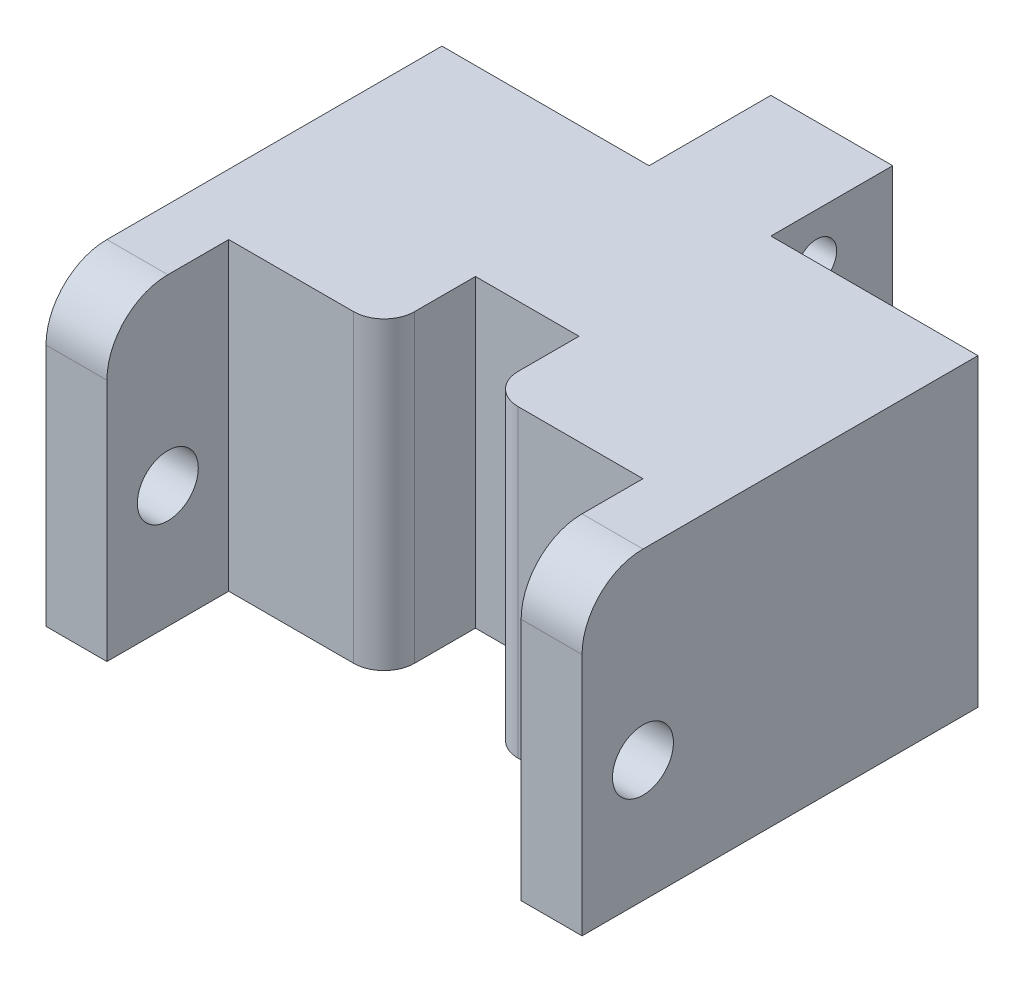
ISO-10303-21;
HEADER;
FILE_DESCRIPTION(('STEP AP214'),'2;1');
FILE_NAME('part.step','',(''),(''),'','','');
FILE_SCHEMA(('AUTOMOTIVE_DESIGN { 1 0 10303 214 1 1 1 1 }'));
ENDSEC;
DATA;
#1=APPLICATION_CONTEXT('core data for automotive mechanical design processes');
#2=APPLICATION_PROTOCOL_DEFINITION('international standard','automotive_design',2000,#1);
#3=PRODUCT_CONTEXT('',#1,'mechanical');
#4=PRODUCT('Part','Part','',(#3));
#5=PRODUCT_RELATED_PRODUCT_CATEGORY('part','',(#4));
#6=PRODUCT_DEFINITION_FORMATION('','',#4);
#7=PRODUCT_DEFINITION_CONTEXT('part definition',#1,'design');
#8=PRODUCT_DEFINITION('design','',#6,#7);
#9=PRODUCT_DEFINITION_SHAPE('','',#8);
#10=(LENGTH_UNIT() NAMED_UNIT(*) SI_UNIT(.MILLI.,.METRE.));
#11=(NAMED_UNIT(*) PLANE_ANGLE_UNIT() SI_UNIT($,.RADIAN.));
#12=(NAMED_UNIT(*) SI_UNIT($,.STERADIAN.) SOLID_ANGLE_UNIT());
#13=UNCERTAINTY_MEASURE_WITH_UNIT(LENGTH_MEASURE(1.E-05),#10,'distance_accuracy_value','');
#14=(GEOMETRIC_REPRESENTATION_CONTEXT(3) GLOBAL_UNCERTAINTY_ASSIGNED_CONTEXT((#13)) GLOBAL_UNIT_ASSIGNED_CONTEXT((#10,
#11,#12)) REPRESENTATION_CONTEXT('',''));
#15=CARTESIAN_POINT('',(0.,0.,0.));
#16=DIRECTION('',(0.,0.,1.));
#17=DIRECTION('',(1.,0.,0.));
#18=AXIS2_PLACEMENT_3D('',#15,#16,#17);
#19=CARTESIAN_POINT('',(-24.,50.,65.));
#20=DIRECTION('',(1.,0.,0.));
#21=DIRECTION('',(0.,0.,-1.));
#22=AXIS2_PLACEMENT_3D('',#19,#20,#21);
#23=PLANE('',#22);
#24=CARTESIAN_POINT('',(-24.,20.,75.));
#25=DIRECTION('',(1.,0.,0.));
#26=DIRECTION('',(0.,0.,-1.));
#27=AXIS2_PLACEMENT_3D('',#24,#25,#26);
#28=CIRCLE('',#27,5.);
#29=CARTESIAN_POINT('',(-24.,20.,70.));
#30=VERTEX_POINT('',#29);
#31=EDGE_CURVE('E189',#30,#30,#28,.T.);
#32=ORIENTED_EDGE('',*,*,#31,.F.);
#33=EDGE_LOOP('',(#32));
#34=FACE_BOUND('',#33,.T.);
#35=DIRECTION('',(0.,0.,1.));
#36=VECTOR('',#35,1.);
#37=CARTESIAN_POINT('',(-24.,50.,65.));
#38=LINE('',#37,#36);
#39=CARTESIAN_POINT('',(-24.,50.,65.));
#40=VERTEX_POINT('',#39);
#41=CARTESIAN_POINT('',(-24.,50.,75.));
#42=VERTEX_POINT('',#41);
#43=EDGE_CURVE('E271',#40,#42,#38,.T.);
#44=ORIENTED_EDGE('',*,*,#43,.T.);
#45=CARTESIAN_POINT('',(-24.,40.,75.));
#46=DIRECTION('',(1.,0.,0.));
#47=DIRECTION('',(0.,0.,-1.));
#48=AXIS2_PLACEMENT_3D('',#45,#46,#47);
#49=CIRCLE('',#48,10.);
#50=CARTESIAN_POINT('',(-24.,40.,85.));
#51=VERTEX_POINT('',#50);
#52=EDGE_CURVE('E217',#42,#51,#49,.T.);
#53=ORIENTED_EDGE('',*,*,#52,.T.);
#54=DIRECTION('',(0.,-1.,0.));
#55=VECTOR('',#54,1.);
#56=CARTESIAN_POINT('',(-24.,50.,85.));
#57=LINE('',#56,#55);
#58=CARTESIAN_POINT('',(-24.,0.,85.));
#59=VERTEX_POINT('',#58);
#60=EDGE_CURVE('E206',#51,#59,#57,.T.);
#61=ORIENTED_EDGE('',*,*,#60,.T.);
#62=DIRECTION('',(0.,0.,1.));
#63=VECTOR('',#62,1.);
#64=CARTESIAN_POINT('',(-24.,0.,65.));
#65=LINE('',#64,#63);
#66=CARTESIAN_POINT('',(-24.,0.,65.));
#67=VERTEX_POINT('',#66);
#68=EDGE_CURVE('E299',#67,#59,#65,.T.);
#69=ORIENTED_EDGE('',*,*,#68,.F.);
#70=DIRECTION('',(0.,-1.,0.));
#71=VECTOR('',#70,1.);
#72=CARTESIAN_POINT('',(-24.,50.,65.));
#73=LINE('',#72,#71);
#74=EDGE_CURVE('E213',#40,#67,#73,.T.);
#75=ORIENTED_EDGE('',*,*,#74,.F.);
#76=EDGE_LOOP('',(#44,#53,#61,#69,#75));
#77=FACE_BOUND('',#76,.T.);
#78=ADVANCED_FACE('F33',(#34,#77),#23,.T.);
#79=CARTESIAN_POINT('',(-24.,50.,65.));
#80=DIRECTION('',(0.,0.,-1.));
#81=DIRECTION('',(-1.,0.,0.));
#82=AXIS2_PLACEMENT_3D('',#79,#80,#81);
#83=PLANE('',#82);
#84=DIRECTION('',(1.,0.,0.));
#85=VECTOR('',#84,1.);
#86=CARTESIAN_POINT('',(-24.,0.,65.));
#87=LINE('',#86,#85);
#88=CARTESIAN_POINT('',(-3.50000000000001,0.,65.));
#89=VERTEX_POINT('',#88);
#90=EDGE_CURVE('E268',#67,#89,#87,.T.);
#91=ORIENTED_EDGE('',*,*,#90,.T.);
#92=DIRECTION('',(0.,-1.,0.));
#93=VECTOR('',#92,1.);
#94=CARTESIAN_POINT('',(-3.50000000000001,50.,65.));
#95=LINE('',#94,#93);
#96=CARTESIAN_POINT('',(-3.50000000000001,50.,65.));
#97=VERTEX_POINT('',#96);
#98=EDGE_CURVE('E233',#89,#97,#95,.F.);
#99=ORIENTED_EDGE('',*,*,#98,.T.);
#100=DIRECTION('',(1.,0.,0.));
#101=VECTOR('',#100,1.);
#102=CARTESIAN_POINT('',(-24.,50.,65.));
#103=LINE('',#102,#101);
#104=EDGE_CURVE('E208',#40,#97,#103,.T.);
#105=ORIENTED_EDGE('',*,*,#104,.F.);
#106=ORIENTED_EDGE('',*,*,#74,.T.);
#107=EDGE_LOOP('',(#91,#99,#105,#106));
#108=FACE_BOUND('',#107,.T.);
#109=ADVANCED_FACE('F364',(#108),#83,.F.);
#110=CARTESIAN_POINT('',(1.49999999999999,50.,65.));
#111=DIRECTION('',(-1.,0.,0.));
#112=DIRECTION('',(0.,0.,1.));
#113=AXIS2_PLACEMENT_3D('',#110,#111,#112);
#114=PLANE('',#113);
#115=DIRECTION('',(0.,0.,-1.));
#116=VECTOR('',#115,1.);
#117=CARTESIAN_POINT('',(1.49999999999999,50.,65.));
#118=LINE('',#117,#116);
#119=CARTESIAN_POINT('',(1.49999999999999,50.,60.));
#120=VERTEX_POINT('',#119);
#121=CARTESIAN_POINT('',(1.49999999999999,50.,50.));
#122=VERTEX_POINT('',#121);
#123=EDGE_CURVE('E328',#120,#122,#118,.T.);
#124=ORIENTED_EDGE('',*,*,#123,.F.);
#125=DIRECTION('',(0.,-1.,0.));
#126=VECTOR('',#125,1.);
#127=CARTESIAN_POINT('',(1.49999999999999,50.,60.));
#128=LINE('',#127,#126);
#129=CARTESIAN_POINT('',(1.49999999999999,0.,60.));
#130=VERTEX_POINT('',#129);
#131=EDGE_CURVE('E228',#120,#130,#128,.T.);
#132=ORIENTED_EDGE('',*,*,#131,.T.);
#133=DIRECTION('',(0.,0.,-1.));
#134=VECTOR('',#133,1.);
#135=CARTESIAN_POINT('',(1.49999999999999,0.,65.));
#136=LINE('',#135,#134);
#137=CARTESIAN_POINT('',(1.49999999999999,0.,50.));
#138=VERTEX_POINT('',#137);
#139=EDGE_CURVE('E266',#130,#138,#136,.T.);
#140=ORIENTED_EDGE('',*,*,#139,.T.);
#141=DIRECTION('',(0.,-1.,0.));
#142=VECTOR('',#141,1.);
#143=CARTESIAN_POINT('',(1.49999999999999,50.,50.));
#144=LINE('',#143,#142);
#145=EDGE_CURVE('E273',#122,#138,#144,.T.);
#146=ORIENTED_EDGE('',*,*,#145,.F.);
#147=EDGE_LOOP('',(#124,#132,#140,#146));
#148=FACE_BOUND('',#147,.T.);
#149=ADVANCED_FACE('F372',(#148),#114,.F.);
#150=CARTESIAN_POINT('',(1.49999999999999,50.,50.));
#151=DIRECTION('',(0.,0.,-1.));
#152=DIRECTION('',(-1.,0.,0.));
#153=AXIS2_PLACEMENT_3D('',#150,#151,#152);
#154=PLANE('',#153);
#155=DIRECTION('',(1.,0.,0.));
#156=VECTOR('',#155,1.);
#157=CARTESIAN_POINT('',(1.49999999999999,0.,50.));
#158=LINE('',#157,#156);
#159=CARTESIAN_POINT('',(18.5,0.,50.));
#160=VERTEX_POINT('',#159);
#161=EDGE_CURVE('E259',#138,#160,#158,.T.);
#162=ORIENTED_EDGE('',*,*,#161,.T.);
#163=DIRECTION('',(0.,-1.,0.));
#164=VECTOR('',#163,1.);
#165=CARTESIAN_POINT('',(18.5,50.,50.));
#166=LINE('',#165,#164);
#167=CARTESIAN_POINT('',(18.5,50.,50.));
#168=VERTEX_POINT('',#167);
#169=EDGE_CURVE('E276',#168,#160,#166,.T.);
#170=ORIENTED_EDGE('',*,*,#169,.F.);
#171=DIRECTION('',(1.,0.,0.));
#172=VECTOR('',#171,1.);
#173=CARTESIAN_POINT('',(1.49999999999999,50.,50.));
#174=LINE('',#173,#172);
#175=EDGE_CURVE('E326',#122,#168,#174,.T.);
#176=ORIENTED_EDGE('',*,*,#175,.F.);
#177=ORIENTED_EDGE('',*,*,#145,.T.);
#178=EDGE_LOOP('',(#162,#170,#176,#177));
#179=FACE_BOUND('',#178,.T.);
#180=ADVANCED_FACE('F419',(#179),#154,.F.);
#181=CARTESIAN_POINT('',(18.5,50.,50.));
#182=DIRECTION('',(1.,0.,0.));
#183=DIRECTION('',(0.,0.,-1.));
#184=AXIS2_PLACEMENT_3D('',#181,#182,#183);
#185=PLANE('',#184);
#186=DIRECTION('',(0.,0.,1.));
#187=VECTOR('',#186,1.);
#188=CARTESIAN_POINT('',(18.5,0.,50.));
#189=LINE('',#188,#187);
#190=CARTESIAN_POINT('',(18.5,0.,60.));
#191=VERTEX_POINT('',#190);
#192=EDGE_CURVE('E257',#160,#191,#189,.T.);
#193=ORIENTED_EDGE('',*,*,#192,.T.);
#194=DIRECTION('',(0.,-1.,0.));
#195=VECTOR('',#194,1.);
#196=CARTESIAN_POINT('',(18.5,50.,60.));
#197=LINE('',#196,#195);
#198=CARTESIAN_POINT('',(18.5,50.,60.));
#199=VERTEX_POINT('',#198);
#200=EDGE_CURVE('E41',#191,#199,#197,.F.);
#201=ORIENTED_EDGE('',*,*,#200,.T.);
#202=DIRECTION('',(0.,0.,1.));
#203=VECTOR('',#202,1.);
#204=CARTESIAN_POINT('',(18.5,50.,50.));
#205=LINE('',#204,#203);
#206=EDGE_CURVE('E324',#168,#199,#205,.T.);
#207=ORIENTED_EDGE('',*,*,#206,.F.);
#208=ORIENTED_EDGE('',*,*,#169,.T.);
#209=EDGE_LOOP('',(#193,#201,#207,#208));
#210=FACE_BOUND('',#209,.T.);
#211=ADVANCED_FACE('F421',(#210),#185,.F.);
#212=CARTESIAN_POINT('',(44.,50.,65.));
#213=DIRECTION('',(0.,0.,1.));
#214=DIRECTION('',(1.,0.,0.));
#215=AXIS2_PLACEMENT_3D('',#212,#213,#214);
#216=PLANE('',#215);
#217=DIRECTION('',(-1.,0.,0.));
#218=VECTOR('',#217,1.);
#219=CARTESIAN_POINT('',(44.,50.,65.));
#220=LINE('',#219,#218);
#221=CARTESIAN_POINT('',(44.,50.,65.));
#222=VERTEX_POINT('',#221);
#223=CARTESIAN_POINT('',(23.5,50.,65.));
#224=VERTEX_POINT('',#223);
#225=EDGE_CURVE('E249',#222,#224,#220,.T.);
#226=ORIENTED_EDGE('',*,*,#225,.T.);
#227=DIRECTION('',(0.,-1.,0.));
#228=VECTOR('',#227,1.);
#229=CARTESIAN_POINT('',(23.5,0.,65.));
#230=LINE('',#229,#228);
#231=CARTESIAN_POINT('',(23.5,0.,65.));
#232=VERTEX_POINT('',#231);
#233=EDGE_CURVE('E237',#224,#232,#230,.T.);
#234=ORIENTED_EDGE('',*,*,#233,.T.);
#235=DIRECTION('',(-1.,0.,0.));
#236=VECTOR('',#235,1.);
#237=CARTESIAN_POINT('',(44.,0.,65.));
#238=LINE('',#237,#236);
#239=CARTESIAN_POINT('',(44.,0.,65.));
#240=VERTEX_POINT('',#239);
#241=EDGE_CURVE('E246',#240,#232,#238,.T.);
#242=ORIENTED_EDGE('',*,*,#241,.F.);
#243=DIRECTION('',(0.,-1.,0.));
#244=VECTOR('',#243,1.);
#245=CARTESIAN_POINT('',(44.,50.,65.));
#246=LINE('',#245,#244);
#247=EDGE_CURVE('E279',#222,#240,#246,.T.);
#248=ORIENTED_EDGE('',*,*,#247,.F.);
#249=EDGE_LOOP('',(#226,#234,#242,#248));
#250=FACE_BOUND('',#249,.T.);
#251=ADVANCED_FACE('F244',(#250),#216,.T.);
#252=CARTESIAN_POINT('',(44.,50.,85.));
#253=DIRECTION('',(-1.,0.,0.));
#254=DIRECTION('',(0.,0.,1.));
#255=AXIS2_PLACEMENT_3D('',#252,#253,#254);
#256=PLANE('',#255);
#257=CARTESIAN_POINT('',(44.,20.,75.));
#258=DIRECTION('',(-1.,0.,0.));
#259=DIRECTION('',(0.,0.,1.));
#260=AXIS2_PLACEMENT_3D('',#257,#258,#259);
#261=CIRCLE('',#260,5.);
#262=CARTESIAN_POINT('',(44.,20.,80.));
#263=VERTEX_POINT('',#262);
#264=EDGE_CURVE('E463',#263,#263,#261,.T.);
#265=ORIENTED_EDGE('',*,*,#264,.F.);
#266=EDGE_LOOP('',(#265));
#267=FACE_BOUND('',#266,.T.);
#268=DIRECTION('',(0.,-1.,0.));
#269=VECTOR('',#268,1.);
#270=CARTESIAN_POINT('',(44.,50.,85.));
#271=LINE('',#270,#269);
#272=CARTESIAN_POINT('',(44.,40.,85.));
#273=VERTEX_POINT('',#272);
#274=CARTESIAN_POINT('',(44.,0.,85.));
#275=VERTEX_POINT('',#274);
#276=EDGE_CURVE('E281',#273,#275,#271,.T.);
#277=ORIENTED_EDGE('',*,*,#276,.F.);
#278=CARTESIAN_POINT('',(44.,40.,75.));
#279=DIRECTION('',(-1.,0.,0.));
#280=DIRECTION('',(0.,0.,1.));
#281=AXIS2_PLACEMENT_3D('',#278,#279,#280);
#282=CIRCLE('',#281,10.);
#283=CARTESIAN_POINT('',(44.,50.,75.));
#284=VERTEX_POINT('',#283);
#285=EDGE_CURVE('E222',#273,#284,#282,.T.);
#286=ORIENTED_EDGE('',*,*,#285,.T.);
#287=DIRECTION('',(0.,0.,-1.));
#288=VECTOR('',#287,1.);
#289=CARTESIAN_POINT('',(44.,50.,85.));
#290=LINE('',#289,#288);
#291=EDGE_CURVE('E321',#284,#222,#290,.T.);
#292=ORIENTED_EDGE('',*,*,#291,.T.);
#293=ORIENTED_EDGE('',*,*,#247,.T.);
#294=DIRECTION('',(0.,0.,-1.));
#295=VECTOR('',#294,1.);
#296=CARTESIAN_POINT('',(44.,0.,85.));
#297=LINE('',#296,#295);
#298=EDGE_CURVE('E256',#275,#240,#297,.T.);
#299=ORIENTED_EDGE('',*,*,#298,.F.);
#300=EDGE_LOOP('',(#277,#286,#292,#293,#299));
#301=FACE_BOUND('',#300,.T.);
#302=ADVANCED_FACE('F348',(#267,#301),#256,.T.);
#303=CARTESIAN_POINT('',(54.,50.,85.));
#304=DIRECTION('',(0.,0.,1.));
#305=DIRECTION('',(1.,0.,0.));
#306=AXIS2_PLACEMENT_3D('',#303,#304,#305);
#307=PLANE('',#306);
#308=DIRECTION('',(0.,-1.,0.));
#309=VECTOR('',#308,1.);
#310=CARTESIAN_POINT('',(54.,50.,85.));
#311=LINE('',#310,#309);
#312=CARTESIAN_POINT('',(54.,40.,85.));
#313=VERTEX_POINT('',#312);
#314=CARTESIAN_POINT('',(54.,0.,85.));
#315=VERTEX_POINT('',#314);
#316=EDGE_CURVE('E283',#313,#315,#311,.T.);
#317=ORIENTED_EDGE('',*,*,#316,.F.);
#318=DIRECTION('',(-1.,0.,0.));
#319=VECTOR('',#318,1.);
#320=CARTESIAN_POINT('',(44.,40.,85.));
#321=LINE('',#320,#319);
#322=EDGE_CURVE('E219',#313,#273,#321,.T.);
#323=ORIENTED_EDGE('',*,*,#322,.T.);
#324=ORIENTED_EDGE('',*,*,#276,.T.);
#325=DIRECTION('',(-1.,0.,0.));
#326=VECTOR('',#325,1.);
#327=CARTESIAN_POINT('',(54.,0.,85.));
#328=LINE('',#327,#326);
#329=EDGE_CURVE('E261',#315,#275,#328,.T.);
#330=ORIENTED_EDGE('',*,*,#329,.F.);
#331=EDGE_LOOP('',(#317,#323,#324,#330));
#332=FACE_BOUND('',#331,.T.);
#333=ADVANCED_FACE('F344',(#332),#307,.T.);
#334=CARTESIAN_POINT('',(54.,50.,20.));
#335=DIRECTION('',(1.,0.,0.));
#336=DIRECTION('',(0.,0.,-1.));
#337=AXIS2_PLACEMENT_3D('',#334,#335,#336);
#338=PLANE('',#337);
#339=CARTESIAN_POINT('',(54.,20.,75.));
#340=DIRECTION('',(1.,0.,0.));
#341=DIRECTION('',(0.,0.,-1.));
#342=AXIS2_PLACEMENT_3D('',#339,#340,#341);
#343=CIRCLE('',#342,5.);
#344=CARTESIAN_POINT('',(54.,20.,70.));
#345=VERTEX_POINT('',#344);
#346=EDGE_CURVE('E459',#345,#345,#343,.T.);
#347=ORIENTED_EDGE('',*,*,#346,.F.);
#348=EDGE_LOOP('',(#347));
#349=FACE_BOUND('',#348,.T.);
#350=DIRECTION('',(0.,0.,1.));
#351=VECTOR('',#350,1.);
#352=CARTESIAN_POINT('',(54.,50.,20.));
#353=LINE('',#352,#351);
#354=CARTESIAN_POINT('',(54.,50.,20.));
#355=VERTEX_POINT('',#354);
#356=CARTESIAN_POINT('',(54.,50.,75.));
#357=VERTEX_POINT('',#356);
#358=EDGE_CURVE('E318',#355,#357,#353,.T.);
#359=ORIENTED_EDGE('',*,*,#358,.T.);
#360=CARTESIAN_POINT('',(54.,40.,75.));
#361=DIRECTION('',(1.,0.,0.));
#362=DIRECTION('',(0.,0.,-1.));
#363=AXIS2_PLACEMENT_3D('',#360,#361,#362);
#364=CIRCLE('',#363,10.);
#365=EDGE_CURVE('E226',#357,#313,#364,.T.);
#366=ORIENTED_EDGE('',*,*,#365,.T.);
#367=ORIENTED_EDGE('',*,*,#316,.T.);
#368=DIRECTION('',(0.,0.,1.));
#369=VECTOR('',#368,1.);
#370=CARTESIAN_POINT('',(54.,0.,20.));
#371=LINE('',#370,#369);
#372=CARTESIAN_POINT('',(54.,0.,20.));
#373=VERTEX_POINT('',#372);
#374=EDGE_CURVE('E338',#373,#315,#371,.T.);
#375=ORIENTED_EDGE('',*,*,#374,.F.);
#376=DIRECTION('',(0.,-1.,0.));
#377=VECTOR('',#376,1.);
#378=CARTESIAN_POINT('',(54.,50.,20.));
#379=LINE('',#378,#377);
#380=EDGE_CURVE('E285',#355,#373,#379,.T.);
#381=ORIENTED_EDGE('',*,*,#380,.F.);
#382=EDGE_LOOP('',(#359,#366,#367,#375,#381));
#383=FACE_BOUND('',#382,.T.);
#384=ADVANCED_FACE('F391',(#349,#383),#338,.T.);
#385=CARTESIAN_POINT('',(20.,50.,20.));
#386=DIRECTION('',(0.,0.,-1.));
#387=DIRECTION('',(-1.,0.,0.));
#388=AXIS2_PLACEMENT_3D('',#385,#386,#387);
#389=PLANE('',#388);
#390=DIRECTION('',(-1.,0.,0.));
#391=VECTOR('',#390,1.);
#392=CARTESIAN_POINT('',(37.,15.,20.));
#393=LINE('',#392,#391);
#394=CARTESIAN_POINT('',(20.,15.,20.));
#395=VERTEX_POINT('',#394);
#396=CARTESIAN_POINT('',(0.,15.,20.));
#397=VERTEX_POINT('',#396);
#398=EDGE_CURVE('E169',#395,#397,#393,.T.);
#399=ORIENTED_EDGE('',*,*,#398,.F.);
#400=DIRECTION('',(0.,-1.,0.));
#401=VECTOR('',#400,1.);
#402=CARTESIAN_POINT('',(20.,50.,20.));
#403=LINE('',#402,#401);
#404=CARTESIAN_POINT('',(20.,50.,20.));
#405=VERTEX_POINT('',#404);
#406=EDGE_CURVE('E288',#405,#395,#403,.T.);
#407=ORIENTED_EDGE('',*,*,#406,.F.);
#408=DIRECTION('',(1.,0.,0.));
#409=VECTOR('',#408,1.);
#410=CARTESIAN_POINT('',(20.,50.,20.));
#411=LINE('',#410,#409);
#412=EDGE_CURVE('E315',#405,#355,#411,.T.);
#413=ORIENTED_EDGE('',*,*,#412,.T.);
#414=ORIENTED_EDGE('',*,*,#380,.T.);
#415=DIRECTION('',(1.,0.,0.));
#416=VECTOR('',#415,1.);
#417=CARTESIAN_POINT('',(20.,0.,20.));
#418=LINE('',#417,#416);
#419=CARTESIAN_POINT('',(-34.,0.,20.));
#420=VERTEX_POINT('',#419);
#421=EDGE_CURVE('E336',#420,#373,#418,.T.);
#422=ORIENTED_EDGE('',*,*,#421,.F.);
#423=DIRECTION('',(0.,-1.,0.));
#424=VECTOR('',#423,1.);
#425=CARTESIAN_POINT('',(-34.,50.,20.));
#426=LINE('',#425,#424);
#427=CARTESIAN_POINT('',(-34.,50.,20.));
#428=VERTEX_POINT('',#427);
#429=EDGE_CURVE('E196',#428,#420,#426,.T.);
#430=ORIENTED_EDGE('',*,*,#429,.F.);
#431=DIRECTION('',(1.,0.,0.));
#432=VECTOR('',#431,1.);
#433=CARTESIAN_POINT('',(-34.,50.,20.));
#434=LINE('',#433,#432);
#435=CARTESIAN_POINT('',(0.,50.,20.));
#436=VERTEX_POINT('',#435);
#437=EDGE_CURVE('E195',#428,#436,#434,.T.);
#438=ORIENTED_EDGE('',*,*,#437,.T.);
#439=DIRECTION('',(0.,-1.,0.));
#440=VECTOR('',#439,1.);
#441=CARTESIAN_POINT('',(0.,50.,20.));
#442=LINE('',#441,#440);
#443=EDGE_CURVE('E185',#436,#397,#442,.T.);
#444=ORIENTED_EDGE('',*,*,#443,.T.);
#445=EDGE_LOOP('',(#399,#407,#413,#414,#422,#430,#438,#444));
#446=FACE_BOUND('',#445,.T.);
#447=ADVANCED_FACE('F192',(#446),#389,.T.);
#448=CARTESIAN_POINT('',(20.,50.,0.));
#449=DIRECTION('',(1.,0.,0.));
#450=DIRECTION('',(0.,0.,-1.));
#451=AXIS2_PLACEMENT_3D('',#448,#449,#450);
#452=PLANE('',#451);
#453=CARTESIAN_POINT('',(20.,27.5,12.5));
#454=DIRECTION('',(1.,0.,0.));
#455=DIRECTION('',(0.,0.,-1.));
#456=AXIS2_PLACEMENT_3D('',#453,#454,#455);
#457=CIRCLE('',#456,3.3);
#458=CARTESIAN_POINT('',(20.,27.5,9.20000000000001));
#459=VERTEX_POINT('',#458);
#460=EDGE_CURVE('E554',#459,#459,#457,.F.);
#461=ORIENTED_EDGE('',*,*,#460,.T.);
#462=EDGE_LOOP('',(#461));
#463=FACE_BOUND('',#462,.T.);
#464=CARTESIAN_POINT('',(20.,42.5,12.5));
#465=DIRECTION('',(1.,0.,0.));
#466=DIRECTION('',(0.,0.,-1.));
#467=AXIS2_PLACEMENT_3D('',#464,#465,#466);
#468=CIRCLE('',#467,3.3);
#469=CARTESIAN_POINT('',(20.,42.5,9.20000000000001));
#470=VERTEX_POINT('',#469);
#471=EDGE_CURVE('E466',#470,#470,#468,.F.);
#472=ORIENTED_EDGE('',*,*,#471,.T.);
#473=EDGE_LOOP('',(#472));
#474=FACE_BOUND('',#473,.T.);
#475=DIRECTION('',(0.,0.,1.));
#476=VECTOR('',#475,1.);
#477=CARTESIAN_POINT('',(20.,15.,0.));
#478=LINE('',#477,#476);
#479=CARTESIAN_POINT('',(20.,15.,0.));
#480=VERTEX_POINT('',#479);
#481=EDGE_CURVE('E175',#480,#395,#478,.T.);
#482=ORIENTED_EDGE('',*,*,#481,.F.);
#483=DIRECTION('',(0.,-1.,0.));
#484=VECTOR('',#483,1.);
#485=CARTESIAN_POINT('',(20.,50.,0.));
#486=LINE('',#485,#484);
#487=CARTESIAN_POINT('',(20.,50.,0.));
#488=VERTEX_POINT('',#487);
#489=EDGE_CURVE('E198',#488,#480,#486,.T.);
#490=ORIENTED_EDGE('',*,*,#489,.F.);
#491=DIRECTION('',(0.,0.,1.));
#492=VECTOR('',#491,1.);
#493=CARTESIAN_POINT('',(20.,50.,0.));
#494=LINE('',#493,#492);
#495=EDGE_CURVE('E298',#488,#405,#494,.T.);
#496=ORIENTED_EDGE('',*,*,#495,.T.);
#497=ORIENTED_EDGE('',*,*,#406,.T.);
#498=EDGE_LOOP('',(#482,#490,#496,#497));
#499=FACE_BOUND('',#498,.T.);
#500=ADVANCED_FACE('F297',(#463,#474,#499),#452,.T.);
#501=CARTESIAN_POINT('',(20.,50.,0.));
#502=DIRECTION('',(0.,0.,1.));
#503=DIRECTION('',(1.,0.,0.));
#504=AXIS2_PLACEMENT_3D('',#501,#502,#503);
#505=PLANE('',#504);
#506=ORIENTED_EDGE('',*,*,#489,.T.);
#507=DIRECTION('',(-1.,0.,0.));
#508=VECTOR('',#507,1.);
#509=CARTESIAN_POINT('',(37.,15.,0.));
#510=LINE('',#509,#508);
#511=CARTESIAN_POINT('',(0.,15.,0.));
#512=VERTEX_POINT('',#511);
#513=EDGE_CURVE('E179',#480,#512,#510,.T.);
#514=ORIENTED_EDGE('',*,*,#513,.T.);
#515=DIRECTION('',(0.,-1.,0.));
#516=VECTOR('',#515,1.);
#517=CARTESIAN_POINT('',(0.,50.,0.));
#518=LINE('',#517,#516);
#519=CARTESIAN_POINT('',(0.,50.,0.));
#520=VERTEX_POINT('',#519);
#521=EDGE_CURVE('E188',#520,#512,#518,.T.);
#522=ORIENTED_EDGE('',*,*,#521,.F.);
#523=DIRECTION('',(-1.,0.,0.));
#524=VECTOR('',#523,1.);
#525=CARTESIAN_POINT('',(20.,50.,0.));
#526=LINE('',#525,#524);
#527=EDGE_CURVE('E293',#488,#520,#526,.T.);
#528=ORIENTED_EDGE('',*,*,#527,.F.);
#529=EDGE_LOOP('',(#506,#514,#522,#528));
#530=FACE_BOUND('',#529,.T.);
#531=ADVANCED_FACE('F292',(#530),#505,.F.);
#532=CARTESIAN_POINT('',(0.,50.,20.));
#533=DIRECTION('',(-1.,0.,0.));
#534=DIRECTION('',(0.,0.,1.));
#535=AXIS2_PLACEMENT_3D('',#532,#533,#534);
#536=PLANE('',#535);
#537=CARTESIAN_POINT('',(0.,27.5,12.5));
#538=DIRECTION('',(-1.,0.,0.));
#539=DIRECTION('',(0.,0.,1.));
#540=AXIS2_PLACEMENT_3D('',#537,#538,#539);
#541=CIRCLE('',#540,3.3);
#542=CARTESIAN_POINT('',(0.,27.5,15.8));
#543=VERTEX_POINT('',#542);
#544=EDGE_CURVE('E557',#543,#543,#541,.T.);
#545=ORIENTED_EDGE('',*,*,#544,.F.);
#546=EDGE_LOOP('',(#545));
#547=FACE_BOUND('',#546,.T.);
#548=CARTESIAN_POINT('',(0.,42.5,12.5));
#549=DIRECTION('',(-1.,0.,0.));
#550=DIRECTION('',(0.,0.,1.));
#551=AXIS2_PLACEMENT_3D('',#548,#549,#550);
#552=CIRCLE('',#551,3.3);
#553=CARTESIAN_POINT('',(0.,42.5,15.8));
#554=VERTEX_POINT('',#553);
#555=EDGE_CURVE('E460',#554,#554,#552,.T.);
#556=ORIENTED_EDGE('',*,*,#555,.F.);
#557=EDGE_LOOP('',(#556));
#558=FACE_BOUND('',#557,.T.);
#559=DIRECTION('',(0.,0.,-1.));
#560=VECTOR('',#559,1.);
#561=CARTESIAN_POINT('',(0.,15.,0.));
#562=LINE('',#561,#560);
#563=EDGE_CURVE('E172',#397,#512,#562,.T.);
#564=ORIENTED_EDGE('',*,*,#563,.F.);
#565=ORIENTED_EDGE('',*,*,#443,.F.);
#566=DIRECTION('',(0.,0.,-1.));
#567=VECTOR('',#566,1.);
#568=CARTESIAN_POINT('',(0.,50.,20.));
#569=LINE('',#568,#567);
#570=EDGE_CURVE('E311',#436,#520,#569,.T.);
#571=ORIENTED_EDGE('',*,*,#570,.T.);
#572=ORIENTED_EDGE('',*,*,#521,.T.);
#573=EDGE_LOOP('',(#564,#565,#571,#572));
#574=FACE_BOUND('',#573,.T.);
#575=ADVANCED_FACE('F183',(#547,#558,#574),#536,.T.);
#576=CARTESIAN_POINT('',(-34.,50.,85.));
#577=DIRECTION('',(-1.,0.,0.));
#578=DIRECTION('',(0.,0.,1.));
#579=AXIS2_PLACEMENT_3D('',#576,#577,#578);
#580=PLANE('',#579);
#581=CARTESIAN_POINT('',(-34.,20.,75.));
#582=DIRECTION('',(-1.,0.,0.));
#583=DIRECTION('',(0.,0.,1.));
#584=AXIS2_PLACEMENT_3D('',#581,#582,#583);
#585=CIRCLE('',#584,5.);
#586=CARTESIAN_POINT('',(-34.,20.,80.));
#587=VERTEX_POINT('',#586);
#588=EDGE_CURVE('E457',#587,#587,#585,.T.);
#589=ORIENTED_EDGE('',*,*,#588,.F.);
#590=EDGE_LOOP('',(#589));
#591=FACE_BOUND('',#590,.T.);
#592=DIRECTION('',(0.,-1.,0.));
#593=VECTOR('',#592,1.);
#594=CARTESIAN_POINT('',(-34.,50.,85.));
#595=LINE('',#594,#593);
#596=CARTESIAN_POINT('',(-34.,40.,85.));
#597=VERTEX_POINT('',#596);
#598=CARTESIAN_POINT('',(-34.,0.,85.));
#599=VERTEX_POINT('',#598);
#600=EDGE_CURVE('E201',#597,#599,#595,.T.);
#601=ORIENTED_EDGE('',*,*,#600,.F.);
#602=CARTESIAN_POINT('',(-34.,40.,75.));
#603=DIRECTION('',(-1.,0.,0.));
#604=DIRECTION('',(0.,0.,1.));
#605=AXIS2_PLACEMENT_3D('',#602,#603,#604);
#606=CIRCLE('',#605,10.);
#607=CARTESIAN_POINT('',(-34.,50.,75.));
#608=VERTEX_POINT('',#607);
#609=EDGE_CURVE('E212',#597,#608,#606,.T.);
#610=ORIENTED_EDGE('',*,*,#609,.T.);
#611=DIRECTION('',(0.,0.,-1.));
#612=VECTOR('',#611,1.);
#613=CARTESIAN_POINT('',(-34.,50.,85.));
#614=LINE('',#613,#612);
#615=EDGE_CURVE('E308',#608,#428,#614,.T.);
#616=ORIENTED_EDGE('',*,*,#615,.T.);
#617=ORIENTED_EDGE('',*,*,#429,.T.);
#618=DIRECTION('',(0.,0.,-1.));
#619=VECTOR('',#618,1.);
#620=CARTESIAN_POINT('',(-34.,0.,85.));
#621=LINE('',#620,#619);
#622=EDGE_CURVE('E334',#599,#420,#621,.T.);
#623=ORIENTED_EDGE('',*,*,#622,.F.);
#624=EDGE_LOOP('',(#601,#610,#616,#617,#623));
#625=FACE_BOUND('',#624,.T.);
#626=ADVANCED_FACE('F397',(#591,#625),#580,.T.);
#627=CARTESIAN_POINT('',(-24.,50.,85.));
#628=DIRECTION('',(0.,0.,1.));
#629=DIRECTION('',(1.,0.,0.));
#630=AXIS2_PLACEMENT_3D('',#627,#628,#629);
#631=PLANE('',#630);
#632=ORIENTED_EDGE('',*,*,#60,.F.);
#633=DIRECTION('',(-1.,0.,0.));
#634=VECTOR('',#633,1.);
#635=CARTESIAN_POINT('',(-34.,40.,85.));
#636=LINE('',#635,#634);
#637=EDGE_CURVE('E209',#51,#597,#636,.T.);
#638=ORIENTED_EDGE('',*,*,#637,.T.);
#639=ORIENTED_EDGE('',*,*,#600,.T.);
#640=DIRECTION('',(-1.,0.,0.));
#641=VECTOR('',#640,1.);
#642=CARTESIAN_POINT('',(-24.,0.,85.));
#643=LINE('',#642,#641);
#644=EDGE_CURVE('E302',#59,#599,#643,.T.);
#645=ORIENTED_EDGE('',*,*,#644,.F.);
#646=EDGE_LOOP('',(#632,#638,#639,#645));
#647=FACE_BOUND('',#646,.T.);
#648=ADVANCED_FACE('F379',(#647),#631,.T.);
#649=CARTESIAN_POINT('',(0.,50.,0.));
#650=DIRECTION('',(0.,-1.,0.));
#651=DIRECTION('',(0.,0.,-1.));
#652=AXIS2_PLACEMENT_3D('',#649,#650,#651);
#653=PLANE('',#652);
#654=ORIENTED_EDGE('',*,*,#206,.T.);
#655=CARTESIAN_POINT('',(23.5,50.,60.));
#656=DIRECTION('',(0.,-1.,0.));
#657=DIRECTION('',(0.,0.,-1.));
#658=AXIS2_PLACEMENT_3D('',#655,#656,#657);
#659=CIRCLE('',#658,5.);
#660=EDGE_CURVE('E11',#199,#224,#659,.F.);
#661=ORIENTED_EDGE('',*,*,#660,.T.);
#662=ORIENTED_EDGE('',*,*,#225,.F.);
#663=ORIENTED_EDGE('',*,*,#291,.F.);
#664=DIRECTION('',(-1.,0.,0.));
#665=VECTOR('',#664,1.);
#666=CARTESIAN_POINT('',(54.,50.,75.));
#667=LINE('',#666,#665);
#668=EDGE_CURVE('E224',#284,#357,#667,.F.);
#669=ORIENTED_EDGE('',*,*,#668,.T.);
#670=ORIENTED_EDGE('',*,*,#358,.F.);
#671=ORIENTED_EDGE('',*,*,#412,.F.);
#672=ORIENTED_EDGE('',*,*,#495,.F.);
#673=ORIENTED_EDGE('',*,*,#527,.T.);
#674=ORIENTED_EDGE('',*,*,#570,.F.);
#675=ORIENTED_EDGE('',*,*,#437,.F.);
#676=ORIENTED_EDGE('',*,*,#615,.F.);
#677=DIRECTION('',(-1.,0.,0.));
#678=VECTOR('',#677,1.);
#679=CARTESIAN_POINT('',(-24.,50.,75.));
#680=LINE('',#679,#678);
#681=EDGE_CURVE('E215',#608,#42,#680,.F.);
#682=ORIENTED_EDGE('',*,*,#681,.T.);
#683=ORIENTED_EDGE('',*,*,#43,.F.);
#684=ORIENTED_EDGE('',*,*,#104,.T.);
#685=CARTESIAN_POINT('',(-3.50000000000001,50.,60.));
#686=DIRECTION('',(0.,-1.,0.));
#687=DIRECTION('',(0.,0.,-1.));
#688=AXIS2_PLACEMENT_3D('',#685,#686,#687);
#689=CIRCLE('',#688,5.);
#690=EDGE_CURVE('E235',#97,#120,#689,.F.);
#691=ORIENTED_EDGE('',*,*,#690,.T.);
#692=ORIENTED_EDGE('',*,*,#123,.T.);
#693=ORIENTED_EDGE('',*,*,#175,.T.);
#694=EDGE_LOOP('',(#654,#661,#662,#663,#669,#670,#671,#672,#673,#674,#675,#676,#682,#683,#684,
#691,#692,#693));
#695=FACE_BOUND('',#694,.T.);
#696=ADVANCED_FACE('F351',(#695),#653,.F.);
#697=CARTESIAN_POINT('',(0.,0.,0.));
#698=DIRECTION('',(0.,-1.,0.));
#699=DIRECTION('',(0.,0.,-1.));
#700=AXIS2_PLACEMENT_3D('',#697,#698,#699);
#701=PLANE('',#700);
#702=ORIENTED_EDGE('',*,*,#622,.T.);
#703=ORIENTED_EDGE('',*,*,#421,.T.);
#704=ORIENTED_EDGE('',*,*,#374,.T.);
#705=ORIENTED_EDGE('',*,*,#329,.T.);
#706=ORIENTED_EDGE('',*,*,#298,.T.);
#707=ORIENTED_EDGE('',*,*,#241,.T.);
#708=CARTESIAN_POINT('',(23.5,0.,60.));
#709=DIRECTION('',(0.,-1.,0.));
#710=DIRECTION('',(0.,0.,-1.));
#711=AXIS2_PLACEMENT_3D('',#708,#709,#710);
#712=CIRCLE('',#711,5.);
#713=EDGE_CURVE('E55',#232,#191,#712,.T.);
#714=ORIENTED_EDGE('',*,*,#713,.T.);
#715=ORIENTED_EDGE('',*,*,#192,.F.);
#716=ORIENTED_EDGE('',*,*,#161,.F.);
#717=ORIENTED_EDGE('',*,*,#139,.F.);
#718=CARTESIAN_POINT('',(-3.50000000000001,0.,60.));
#719=DIRECTION('',(0.,-1.,0.));
#720=DIRECTION('',(0.,0.,-1.));
#721=AXIS2_PLACEMENT_3D('',#718,#719,#720);
#722=CIRCLE('',#721,5.);
#723=EDGE_CURVE('E231',#130,#89,#722,.T.);
#724=ORIENTED_EDGE('',*,*,#723,.T.);
#725=ORIENTED_EDGE('',*,*,#90,.F.);
#726=ORIENTED_EDGE('',*,*,#68,.T.);
#727=ORIENTED_EDGE('',*,*,#644,.T.);
#728=EDGE_LOOP('',(#702,#703,#704,#705,#706,#707,#714,#715,#716,#717,#724,#725,#726,#727));
#729=FACE_BOUND('',#728,.T.);
#730=ADVANCED_FACE('F253',(#729),#701,.T.);
#731=CARTESIAN_POINT('',(-24.,40.,75.));
#732=DIRECTION('',(1.,0.,0.));
#733=DIRECTION('',(0.,0.,-1.));
#734=AXIS2_PLACEMENT_3D('',#731,#732,#733);
#735=CYLINDRICAL_SURFACE('',#734,10.);
#736=ORIENTED_EDGE('',*,*,#52,.F.);
#737=ORIENTED_EDGE('',*,*,#681,.F.);
#738=ORIENTED_EDGE('',*,*,#609,.F.);
#739=ORIENTED_EDGE('',*,*,#637,.F.);
#740=EDGE_LOOP('',(#736,#737,#738,#739));
#741=FACE_BOUND('',#740,.T.);
#742=ADVANCED_FACE('F381',(#741),#735,.T.);
#743=CARTESIAN_POINT('',(54.,40.,75.));
#744=DIRECTION('',(1.,0.,0.));
#745=DIRECTION('',(0.,0.,-1.));
#746=AXIS2_PLACEMENT_3D('',#743,#744,#745);
#747=CYLINDRICAL_SURFACE('',#746,10.);
#748=ORIENTED_EDGE('',*,*,#365,.F.);
#749=ORIENTED_EDGE('',*,*,#668,.F.);
#750=ORIENTED_EDGE('',*,*,#285,.F.);
#751=ORIENTED_EDGE('',*,*,#322,.F.);
#752=EDGE_LOOP('',(#748,#749,#750,#751));
#753=FACE_BOUND('',#752,.T.);
#754=ADVANCED_FACE('F361',(#753),#747,.T.);
#755=CARTESIAN_POINT('',(-3.50000000000001,50.,60.));
#756=DIRECTION('',(0.,-1.,0.));
#757=DIRECTION('',(0.,0.,-1.));
#758=AXIS2_PLACEMENT_3D('',#755,#756,#757);
#759=CYLINDRICAL_SURFACE('',#758,5.);
#760=ORIENTED_EDGE('',*,*,#690,.F.);
#761=ORIENTED_EDGE('',*,*,#98,.F.);
#762=ORIENTED_EDGE('',*,*,#723,.F.);
#763=ORIENTED_EDGE('',*,*,#131,.F.);
#764=EDGE_LOOP('',(#760,#761,#762,#763));
#765=FACE_BOUND('',#764,.T.);
#766=ADVANCED_FACE('F354',(#765),#759,.T.);
#767=CARTESIAN_POINT('',(23.5,50.,60.));
#768=DIRECTION('',(0.,1.,0.));
#769=DIRECTION('',(0.,0.,1.));
#770=AXIS2_PLACEMENT_3D('',#767,#768,#769);
#771=CYLINDRICAL_SURFACE('',#770,5.);
#772=ORIENTED_EDGE('',*,*,#660,.F.);
#773=ORIENTED_EDGE('',*,*,#200,.F.);
#774=ORIENTED_EDGE('',*,*,#713,.F.);
#775=ORIENTED_EDGE('',*,*,#233,.F.);
#776=EDGE_LOOP('',(#772,#773,#774,#775));
#777=FACE_BOUND('',#776,.T.);
#778=ADVANCED_FACE('F35',(#777),#771,.T.);
#779=CARTESIAN_POINT('',(37.,15.,0.));
#780=DIRECTION('',(0.,1.,0.));
#781=DIRECTION('',(0.,0.,1.));
#782=AXIS2_PLACEMENT_3D('',#779,#780,#781);
#783=PLANE('',#782);
#784=ORIENTED_EDGE('',*,*,#481,.T.);
#785=ORIENTED_EDGE('',*,*,#398,.T.);
#786=ORIENTED_EDGE('',*,*,#563,.T.);
#787=ORIENTED_EDGE('',*,*,#513,.F.);
#788=EDGE_LOOP('',(#784,#785,#786,#787));
#789=FACE_BOUND('',#788,.T.);
#790=ADVANCED_FACE('F171',(#789),#783,.F.);
#791=CARTESIAN_POINT('',(81.,20.,75.));
#792=DIRECTION('',(-1.,0.,0.));
#793=DIRECTION('',(0.,0.,1.));
#794=AXIS2_PLACEMENT_3D('',#791,#792,#793);
#795=CYLINDRICAL_SURFACE('',#794,5.);
#796=ORIENTED_EDGE('',*,*,#31,.T.);
#797=EDGE_LOOP('',(#796));
#798=FACE_BOUND('',#797,.T.);
#799=ORIENTED_EDGE('',*,*,#588,.T.);
#800=EDGE_LOOP('',(#799));
#801=FACE_BOUND('',#800,.T.);
#802=ADVANCED_FACE('F359',(#798,#801),#795,.F.);
#803=ORIENTED_EDGE('',*,*,#264,.T.);
#804=EDGE_LOOP('',(#803));
#805=FACE_BOUND('',#804,.T.);
#806=ORIENTED_EDGE('',*,*,#346,.T.);
#807=EDGE_LOOP('',(#806));
#808=FACE_BOUND('',#807,.T.);
#809=ADVANCED_FACE('F475',(#805,#808),#795,.F.);
#810=CARTESIAN_POINT('',(54.001,42.5,12.5));
#811=DIRECTION('',(-1.,0.,0.));
#812=DIRECTION('',(0.,0.,1.));
#813=AXIS2_PLACEMENT_3D('',#810,#811,#812);
#814=CYLINDRICAL_SURFACE('',#813,3.3);
#815=ORIENTED_EDGE('',*,*,#471,.F.);
#816=EDGE_LOOP('',(#815));
#817=FACE_BOUND('',#816,.T.);
#818=ORIENTED_EDGE('',*,*,#555,.T.);
#819=EDGE_LOOP('',(#818));
#820=FACE_BOUND('',#819,.T.);
#821=ADVANCED_FACE('F479',(#817,#820),#814,.F.);
#822=CARTESIAN_POINT('',(54.001,27.5,12.5));
#823=DIRECTION('',(-1.,0.,0.));
#824=DIRECTION('',(0.,0.,1.));
#825=AXIS2_PLACEMENT_3D('',#822,#823,#824);
#826=CYLINDRICAL_SURFACE('',#825,3.3);
#827=ORIENTED_EDGE('',*,*,#460,.F.);
#828=EDGE_LOOP('',(#827));
#829=FACE_BOUND('',#828,.T.);
#830=ORIENTED_EDGE('',*,*,#544,.T.);
#831=EDGE_LOOP('',(#830));
#832=FACE_BOUND('',#831,.T.);
#833=ADVANCED_FACE('F539',(#829,#832),#826,.F.);
#834=CLOSED_SHELL('',(#78,#109,#149,#180,#211,#251,#302,#333,#384,#447,#500,#531,#575,#626,#648,
#696,#730,#742,#754,#766,#778,#790,#802,#809,#821,#833));
#835=MANIFOLD_SOLID_BREP('B2',#834);
#836=ADVANCED_BREP_SHAPE_REPRESENTATION('',(#18,#835),#14);
#837=SHAPE_DEFINITION_REPRESENTATION(#9,#836);
ENDSEC;
END-ISO-10303-21;
